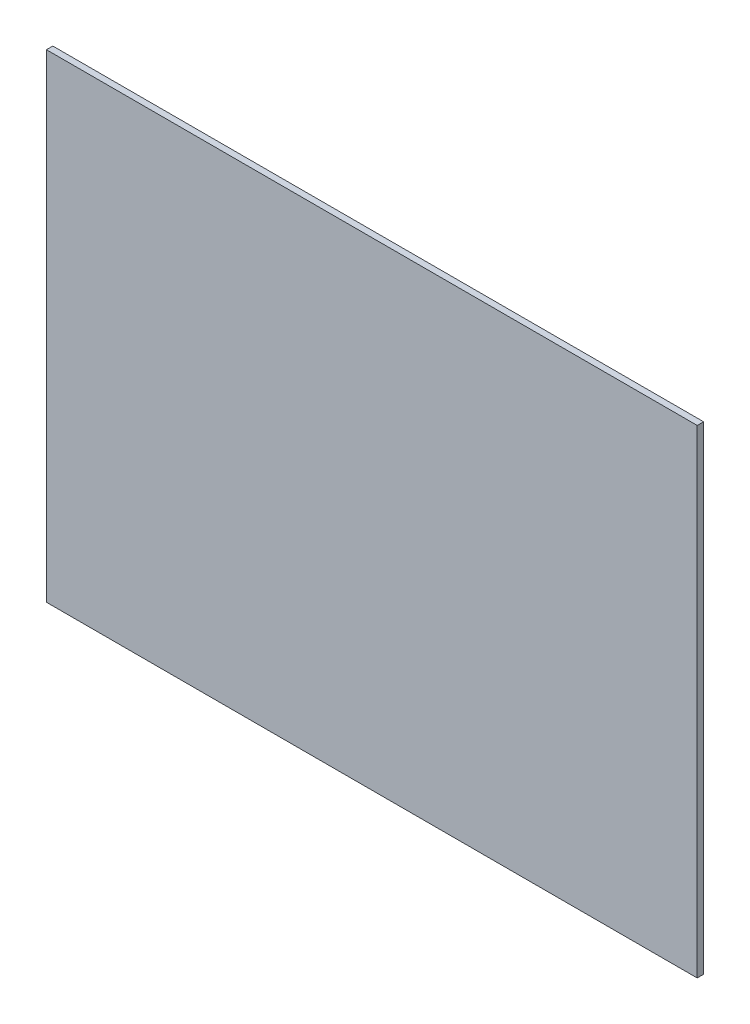
ISO-10303-21;
HEADER;
FILE_DESCRIPTION(('STEP AP214'),'2;1');
FILE_NAME('part.step','',(''),(''),'','','');
FILE_SCHEMA(('AUTOMOTIVE_DESIGN { 1 0 10303 214 1 1 1 1 }'));
ENDSEC;
DATA;
#1=APPLICATION_CONTEXT('core data for automotive mechanical design processes');
#2=APPLICATION_PROTOCOL_DEFINITION('international standard','automotive_design',2000,#1);
#3=PRODUCT_CONTEXT('',#1,'mechanical');
#4=PRODUCT('Part','Part','',(#3));
#5=PRODUCT_RELATED_PRODUCT_CATEGORY('part','',(#4));
#6=PRODUCT_DEFINITION_FORMATION('','',#4);
#7=PRODUCT_DEFINITION_CONTEXT('part definition',#1,'design');
#8=PRODUCT_DEFINITION('design','',#6,#7);
#9=PRODUCT_DEFINITION_SHAPE('','',#8);
#10=(LENGTH_UNIT() NAMED_UNIT(*) SI_UNIT(.MILLI.,.METRE.));
#11=(NAMED_UNIT(*) PLANE_ANGLE_UNIT() SI_UNIT($,.RADIAN.));
#12=(NAMED_UNIT(*) SI_UNIT($,.STERADIAN.) SOLID_ANGLE_UNIT());
#13=UNCERTAINTY_MEASURE_WITH_UNIT(LENGTH_MEASURE(1.E-05),#10,'distance_accuracy_value','');
#14=(GEOMETRIC_REPRESENTATION_CONTEXT(3) GLOBAL_UNCERTAINTY_ASSIGNED_CONTEXT((#13)) GLOBAL_UNIT_ASSIGNED_CONTEXT((#10,
#11,#12)) REPRESENTATION_CONTEXT('',''));
#15=CARTESIAN_POINT('',(0.,0.,0.));
#16=DIRECTION('',(0.,0.,1.));
#17=DIRECTION('',(1.,0.,0.));
#18=AXIS2_PLACEMENT_3D('',#15,#16,#17);
#19=CARTESIAN_POINT('',(-98.2329545454546,-113.198863636364,2.));
#20=DIRECTION('',(1.,0.,0.));
#21=DIRECTION('',(0.,0.,-1.));
#22=AXIS2_PLACEMENT_3D('',#19,#20,#21);
#23=PLANE('',#22);
#24=DIRECTION('',(0.,-1.,0.));
#25=VECTOR('',#24,1.);
#26=CARTESIAN_POINT('',(-98.2329545454546,-113.198863636364,0.));
#27=LINE('',#26,#25);
#28=CARTESIAN_POINT('',(-98.2329545454546,36.8011363636364,0.));
#29=VERTEX_POINT('',#28);
#30=CARTESIAN_POINT('',(-98.2329545454546,-113.198863636364,0.));
#31=VERTEX_POINT('',#30);
#32=EDGE_CURVE('E107',#29,#31,#27,.T.);
#33=ORIENTED_EDGE('',*,*,#32,.T.);
#34=DIRECTION('',(0.,0.,-1.));
#35=VECTOR('',#34,1.);
#36=CARTESIAN_POINT('',(-98.2329545454546,-113.198863636364,2.));
#37=LINE('',#36,#35);
#38=CARTESIAN_POINT('',(-98.2329545454546,-113.198863636364,2.));
#39=VERTEX_POINT('',#38);
#40=EDGE_CURVE('E11',#39,#31,#37,.T.);
#41=ORIENTED_EDGE('',*,*,#40,.F.);
#42=DIRECTION('',(0.,-1.,0.));
#43=VECTOR('',#42,1.);
#44=CARTESIAN_POINT('',(-98.2329545454546,-113.198863636364,2.));
#45=LINE('',#44,#43);
#46=CARTESIAN_POINT('',(-98.2329545454546,36.8011363636364,2.));
#47=VERTEX_POINT('',#46);
#48=EDGE_CURVE('E91',#47,#39,#45,.T.);
#49=ORIENTED_EDGE('',*,*,#48,.F.);
#50=DIRECTION('',(0.,0.,-1.));
#51=VECTOR('',#50,1.);
#52=CARTESIAN_POINT('',(-98.2329545454546,36.8011363636364,2.));
#53=LINE('',#52,#51);
#54=EDGE_CURVE('E103',#47,#29,#53,.T.);
#55=ORIENTED_EDGE('',*,*,#54,.T.);
#56=EDGE_LOOP('',(#33,#41,#49,#55));
#57=FACE_BOUND('',#56,.T.);
#58=ADVANCED_FACE('F39',(#57),#23,.F.);
#59=CARTESIAN_POINT('',(105.767045454545,-113.198863636364,2.));
#60=DIRECTION('',(0.,1.,0.));
#61=DIRECTION('',(-1.,0.,0.));
#62=AXIS2_PLACEMENT_3D('',#59,#60,#61);
#63=PLANE('',#62);
#64=DIRECTION('',(1.,0.,0.));
#65=VECTOR('',#64,1.);
#66=CARTESIAN_POINT('',(105.767045454545,-113.198863636364,0.));
#67=LINE('',#66,#65);
#68=CARTESIAN_POINT('',(105.767045454545,-113.198863636364,0.));
#69=VERTEX_POINT('',#68);
#70=EDGE_CURVE('E96',#31,#69,#67,.T.);
#71=ORIENTED_EDGE('',*,*,#70,.T.);
#72=DIRECTION('',(0.,0.,-1.));
#73=VECTOR('',#72,1.);
#74=CARTESIAN_POINT('',(105.767045454545,-113.198863636364,2.));
#75=LINE('',#74,#73);
#76=CARTESIAN_POINT('',(105.767045454545,-113.198863636364,2.));
#77=VERTEX_POINT('',#76);
#78=EDGE_CURVE('E48',#77,#69,#75,.T.);
#79=ORIENTED_EDGE('',*,*,#78,.F.);
#80=DIRECTION('',(1.,0.,0.));
#81=VECTOR('',#80,1.);
#82=CARTESIAN_POINT('',(105.767045454545,-113.198863636364,2.));
#83=LINE('',#82,#81);
#84=EDGE_CURVE('E86',#39,#77,#83,.T.);
#85=ORIENTED_EDGE('',*,*,#84,.F.);
#86=ORIENTED_EDGE('',*,*,#40,.T.);
#87=EDGE_LOOP('',(#71,#79,#85,#86));
#88=FACE_BOUND('',#87,.T.);
#89=ADVANCED_FACE('F95',(#88),#63,.F.);
#90=CARTESIAN_POINT('',(105.767045454545,36.8011363636364,2.));
#91=DIRECTION('',(-1.,0.,0.));
#92=DIRECTION('',(0.,-1.,0.));
#93=AXIS2_PLACEMENT_3D('',#90,#91,#92);
#94=PLANE('',#93);
#95=DIRECTION('',(0.,1.,0.));
#96=VECTOR('',#95,1.);
#97=CARTESIAN_POINT('',(105.767045454545,36.8011363636364,0.));
#98=LINE('',#97,#96);
#99=CARTESIAN_POINT('',(105.767045454545,36.8011363636364,0.));
#100=VERTEX_POINT('',#99);
#101=EDGE_CURVE('E73',#69,#100,#98,.T.);
#102=ORIENTED_EDGE('',*,*,#101,.T.);
#103=DIRECTION('',(0.,0.,-1.));
#104=VECTOR('',#103,1.);
#105=CARTESIAN_POINT('',(105.767045454545,36.8011363636364,2.));
#106=LINE('',#105,#104);
#107=CARTESIAN_POINT('',(105.767045454545,36.8011363636364,2.));
#108=VERTEX_POINT('',#107);
#109=EDGE_CURVE('E98',#108,#100,#106,.T.);
#110=ORIENTED_EDGE('',*,*,#109,.F.);
#111=DIRECTION('',(0.,1.,0.));
#112=VECTOR('',#111,1.);
#113=CARTESIAN_POINT('',(105.767045454545,36.8011363636364,2.));
#114=LINE('',#113,#112);
#115=EDGE_CURVE('E89',#77,#108,#114,.T.);
#116=ORIENTED_EDGE('',*,*,#115,.F.);
#117=ORIENTED_EDGE('',*,*,#78,.T.);
#118=EDGE_LOOP('',(#102,#110,#116,#117));
#119=FACE_BOUND('',#118,.T.);
#120=ADVANCED_FACE('F99',(#119),#94,.F.);
#121=CARTESIAN_POINT('',(-98.2329545454546,36.8011363636364,2.));
#122=DIRECTION('',(0.,-1.,0.));
#123=DIRECTION('',(0.,0.,-1.));
#124=AXIS2_PLACEMENT_3D('',#121,#122,#123);
#125=PLANE('',#124);
#126=DIRECTION('',(-1.,0.,0.));
#127=VECTOR('',#126,1.);
#128=CARTESIAN_POINT('',(-98.2329545454546,36.8011363636364,0.));
#129=LINE('',#128,#127);
#130=EDGE_CURVE('E79',#100,#29,#129,.T.);
#131=ORIENTED_EDGE('',*,*,#130,.T.);
#132=ORIENTED_EDGE('',*,*,#54,.F.);
#133=DIRECTION('',(-1.,0.,0.));
#134=VECTOR('',#133,1.);
#135=CARTESIAN_POINT('',(-98.2329545454546,36.8011363636364,2.));
#136=LINE('',#135,#134);
#137=EDGE_CURVE('E56',#108,#47,#136,.T.);
#138=ORIENTED_EDGE('',*,*,#137,.F.);
#139=ORIENTED_EDGE('',*,*,#109,.T.);
#140=EDGE_LOOP('',(#131,#132,#138,#139));
#141=FACE_BOUND('',#140,.T.);
#142=ADVANCED_FACE('F120',(#141),#125,.F.);
#143=CARTESIAN_POINT('',(0.,0.,2.));
#144=DIRECTION('',(0.,0.,-1.));
#145=DIRECTION('',(-1.,0.,0.));
#146=AXIS2_PLACEMENT_3D('',#143,#144,#145);
#147=PLANE('',#146);
#148=ORIENTED_EDGE('',*,*,#48,.T.);
#149=ORIENTED_EDGE('',*,*,#84,.T.);
#150=ORIENTED_EDGE('',*,*,#115,.T.);
#151=ORIENTED_EDGE('',*,*,#137,.T.);
#152=EDGE_LOOP('',(#148,#149,#150,#151));
#153=FACE_BOUND('',#152,.T.);
#154=ADVANCED_FACE('F87',(#153),#147,.F.);
#155=CARTESIAN_POINT('',(0.,0.,0.));
#156=DIRECTION('',(0.,0.,-1.));
#157=DIRECTION('',(-1.,0.,0.));
#158=AXIS2_PLACEMENT_3D('',#155,#156,#157);
#159=PLANE('',#158);
#160=ORIENTED_EDGE('',*,*,#32,.F.);
#161=ORIENTED_EDGE('',*,*,#130,.F.);
#162=ORIENTED_EDGE('',*,*,#101,.F.);
#163=ORIENTED_EDGE('',*,*,#70,.F.);
#164=EDGE_LOOP('',(#160,#161,#162,#163));
#165=FACE_BOUND('',#164,.T.);
#166=ADVANCED_FACE('F123',(#165),#159,.T.);
#167=CLOSED_SHELL('',(#58,#89,#120,#142,#154,#166));
#168=MANIFOLD_SOLID_BREP('B2',#167);
#169=ADVANCED_BREP_SHAPE_REPRESENTATION('',(#18,#168),#14);
#170=SHAPE_DEFINITION_REPRESENTATION(#9,#169);
ENDSEC;
END-ISO-10303-21;
